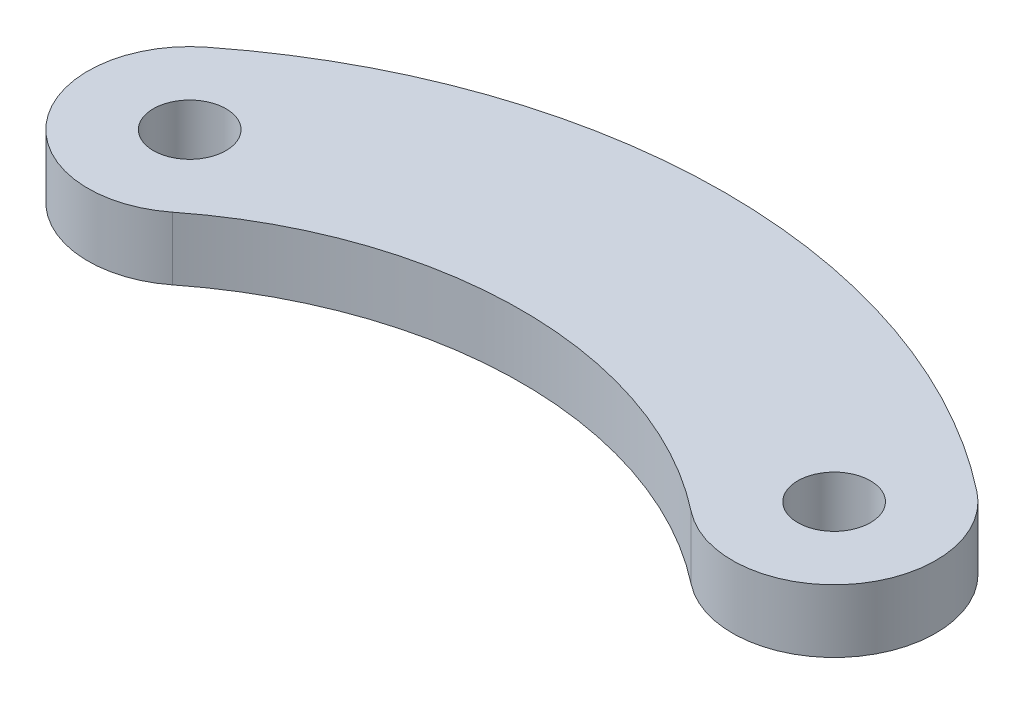
ISO-10303-21;
HEADER;
FILE_DESCRIPTION(('STEP AP214'),'2;1');
FILE_NAME('part.step','',(''),(''),'','','');
FILE_SCHEMA(('AUTOMOTIVE_DESIGN { 1 0 10303 214 1 1 1 1 }'));
ENDSEC;
DATA;
#1=APPLICATION_CONTEXT('core data for automotive mechanical design processes');
#2=APPLICATION_PROTOCOL_DEFINITION('international standard','automotive_design',2000,#1);
#3=PRODUCT_CONTEXT('',#1,'mechanical');
#4=PRODUCT('Part','Part','',(#3));
#5=PRODUCT_RELATED_PRODUCT_CATEGORY('part','',(#4));
#6=PRODUCT_DEFINITION_FORMATION('','',#4);
#7=PRODUCT_DEFINITION_CONTEXT('part definition',#1,'design');
#8=PRODUCT_DEFINITION('design','',#6,#7);
#9=PRODUCT_DEFINITION_SHAPE('','',#8);
#10=(LENGTH_UNIT() NAMED_UNIT(*) SI_UNIT(.MILLI.,.METRE.));
#11=(NAMED_UNIT(*) PLANE_ANGLE_UNIT() SI_UNIT($,.RADIAN.));
#12=(NAMED_UNIT(*) SI_UNIT($,.STERADIAN.) SOLID_ANGLE_UNIT());
#13=UNCERTAINTY_MEASURE_WITH_UNIT(LENGTH_MEASURE(1.E-05),#10,'distance_accuracy_value','');
#14=(GEOMETRIC_REPRESENTATION_CONTEXT(3) GLOBAL_UNCERTAINTY_ASSIGNED_CONTEXT((#13)) GLOBAL_UNIT_ASSIGNED_CONTEXT((#10,
#11,#12)) REPRESENTATION_CONTEXT('',''));
#15=CARTESIAN_POINT('',(0.,0.,0.));
#16=DIRECTION('',(0.,0.,1.));
#17=DIRECTION('',(1.,0.,0.));
#18=AXIS2_PLACEMENT_3D('',#15,#16,#17);
#19=CARTESIAN_POINT('',(-6.65,2.6,-8.46358695652175));
#20=DIRECTION('',(0.,1.,0.));
#21=DIRECTION('',(0.,0.,1.));
#22=AXIS2_PLACEMENT_3D('',#19,#20,#21);
#23=PLANE('',#22);
#24=CARTESIAN_POINT('',(13.3,2.6,-16.9271739130435));
#25=DIRECTION('',(0.,1.,0.));
#26=DIRECTION('',(0.,0.,1.));
#27=AXIS2_PLACEMENT_3D('',#24,#25,#26);
#28=CIRCLE('',#27,1.5);
#29=CARTESIAN_POINT('',(13.3,2.6,-15.4271739130435));
#30=VERTEX_POINT('',#29);
#31=EDGE_CURVE('E99',#30,#30,#28,.T.);
#32=ORIENTED_EDGE('',*,*,#31,.F.);
#33=EDGE_LOOP('',(#32));
#34=FACE_BOUND('',#33,.T.);
#35=CARTESIAN_POINT('',(-13.3,2.6,-16.9271739130435));
#36=DIRECTION('',(0.,1.,0.));
#37=DIRECTION('',(0.,0.,1.));
#38=AXIS2_PLACEMENT_3D('',#35,#36,#37);
#39=CIRCLE('',#38,4.2);
#40=CARTESIAN_POINT('',(-15.8948598838677,2.6,-20.2297035772697));
#41=VERTEX_POINT('',#40);
#42=CARTESIAN_POINT('',(-10.7051401161323,2.6,-13.6246442488173));
#43=VERTEX_POINT('',#42);
#44=EDGE_CURVE('E84',#41,#43,#39,.T.);
#45=ORIENTED_EDGE('',*,*,#44,.T.);
#46=CARTESIAN_POINT('',(0.,2.6,0.));
#47=DIRECTION('',(0.,-1.,0.));
#48=DIRECTION('',(0.,0.,1.));
#49=AXIS2_PLACEMENT_3D('',#46,#47,#48);
#50=CIRCLE('',#49,17.3271739130435);
#51=CARTESIAN_POINT('',(10.7051401161323,2.6,-13.6246442488173));
#52=VERTEX_POINT('',#51);
#53=EDGE_CURVE('E79',#43,#52,#50,.T.);
#54=ORIENTED_EDGE('',*,*,#53,.T.);
#55=CARTESIAN_POINT('',(13.3,2.6,-16.9271739130435));
#56=DIRECTION('',(0.,1.,0.));
#57=DIRECTION('',(0.,0.,1.));
#58=AXIS2_PLACEMENT_3D('',#55,#56,#57);
#59=CIRCLE('',#58,4.2);
#60=CARTESIAN_POINT('',(15.8948598838677,2.6,-20.2297035772697));
#61=VERTEX_POINT('',#60);
#62=EDGE_CURVE('E82',#52,#61,#59,.T.);
#63=ORIENTED_EDGE('',*,*,#62,.T.);
#64=CARTESIAN_POINT('',(0.,2.6,0.));
#65=DIRECTION('',(0.,1.,0.));
#66=DIRECTION('',(0.,0.,1.));
#67=AXIS2_PLACEMENT_3D('',#64,#65,#66);
#68=CIRCLE('',#67,25.7271739130435);
#69=EDGE_CURVE('E49',#61,#41,#68,.T.);
#70=ORIENTED_EDGE('',*,*,#69,.T.);
#71=EDGE_LOOP('',(#45,#54,#63,#70));
#72=FACE_BOUND('',#71,.T.);
#73=CARTESIAN_POINT('',(-13.3,2.6,-16.9271739130435));
#74=DIRECTION('',(0.,1.,0.));
#75=DIRECTION('',(0.,0.,1.));
#76=AXIS2_PLACEMENT_3D('',#73,#74,#75);
#77=CIRCLE('',#76,1.5);
#78=CARTESIAN_POINT('',(-13.3,2.6,-15.4271739130435));
#79=VERTEX_POINT('',#78);
#80=EDGE_CURVE('E114',#79,#79,#77,.T.);
#81=ORIENTED_EDGE('',*,*,#80,.F.);
#82=EDGE_LOOP('',(#81));
#83=FACE_BOUND('',#82,.T.);
#84=ADVANCED_FACE('F32',(#34,#72,#83),#23,.T.);
#85=CARTESIAN_POINT('',(-6.65,0.,-8.46358695652175));
#86=DIRECTION('',(0.,1.,0.));
#87=DIRECTION('',(0.,0.,1.));
#88=AXIS2_PLACEMENT_3D('',#85,#86,#87);
#89=PLANE('',#88);
#90=CARTESIAN_POINT('',(13.3,0.,-16.9271739130435));
#91=DIRECTION('',(0.,1.,0.));
#92=DIRECTION('',(0.,0.,1.));
#93=AXIS2_PLACEMENT_3D('',#90,#91,#92);
#94=CIRCLE('',#93,1.5);
#95=CARTESIAN_POINT('',(13.3,0.,-15.4271739130435));
#96=VERTEX_POINT('',#95);
#97=EDGE_CURVE('E111',#96,#96,#94,.T.);
#98=ORIENTED_EDGE('',*,*,#97,.T.);
#99=EDGE_LOOP('',(#98));
#100=FACE_BOUND('',#99,.T.);
#101=CARTESIAN_POINT('',(-13.3,0.,-16.9271739130435));
#102=DIRECTION('',(0.,1.,0.));
#103=DIRECTION('',(0.,0.,1.));
#104=AXIS2_PLACEMENT_3D('',#101,#102,#103);
#105=CIRCLE('',#104,4.2);
#106=CARTESIAN_POINT('',(-15.8948598838677,0.,-20.2297035772697));
#107=VERTEX_POINT('',#106);
#108=CARTESIAN_POINT('',(-10.7051401161323,0.,-13.6246442488173));
#109=VERTEX_POINT('',#108);
#110=EDGE_CURVE('E96',#107,#109,#105,.T.);
#111=ORIENTED_EDGE('',*,*,#110,.F.);
#112=CARTESIAN_POINT('',(0.,0.,0.));
#113=DIRECTION('',(0.,1.,0.));
#114=DIRECTION('',(0.,0.,1.));
#115=AXIS2_PLACEMENT_3D('',#112,#113,#114);
#116=CIRCLE('',#115,25.7271739130435);
#117=CARTESIAN_POINT('',(15.8948598838677,0.,-20.2297035772697));
#118=VERTEX_POINT('',#117);
#119=EDGE_CURVE('E72',#118,#107,#116,.T.);
#120=ORIENTED_EDGE('',*,*,#119,.F.);
#121=CARTESIAN_POINT('',(13.3,0.,-16.9271739130435));
#122=DIRECTION('',(0.,1.,0.));
#123=DIRECTION('',(0.,0.,1.));
#124=AXIS2_PLACEMENT_3D('',#121,#122,#123);
#125=CIRCLE('',#124,4.2);
#126=CARTESIAN_POINT('',(10.7051401161323,0.,-13.6246442488173));
#127=VERTEX_POINT('',#126);
#128=EDGE_CURVE('E66',#127,#118,#125,.T.);
#129=ORIENTED_EDGE('',*,*,#128,.F.);
#130=CARTESIAN_POINT('',(0.,0.,0.));
#131=DIRECTION('',(0.,-1.,0.));
#132=DIRECTION('',(0.,0.,1.));
#133=AXIS2_PLACEMENT_3D('',#130,#131,#132);
#134=CIRCLE('',#133,17.3271739130435);
#135=EDGE_CURVE('E88',#109,#127,#134,.T.);
#136=ORIENTED_EDGE('',*,*,#135,.F.);
#137=EDGE_LOOP('',(#111,#120,#129,#136));
#138=FACE_BOUND('',#137,.T.);
#139=CARTESIAN_POINT('',(-13.3,0.,-16.9271739130435));
#140=DIRECTION('',(0.,1.,0.));
#141=DIRECTION('',(0.,0.,1.));
#142=AXIS2_PLACEMENT_3D('',#139,#140,#141);
#143=CIRCLE('',#142,1.5);
#144=CARTESIAN_POINT('',(-13.3,0.,-15.4271739130435));
#145=VERTEX_POINT('',#144);
#146=EDGE_CURVE('E117',#145,#145,#143,.T.);
#147=ORIENTED_EDGE('',*,*,#146,.T.);
#148=EDGE_LOOP('',(#147));
#149=FACE_BOUND('',#148,.T.);
#150=ADVANCED_FACE('F107',(#100,#138,#149),#89,.F.);
#151=CARTESIAN_POINT('',(-13.3,2.6,-16.9271739130435));
#152=DIRECTION('',(0.,-1.,0.));
#153=DIRECTION('',(0.,0.,-1.));
#154=AXIS2_PLACEMENT_3D('',#151,#152,#153);
#155=CYLINDRICAL_SURFACE('',#154,4.2);
#156=ORIENTED_EDGE('',*,*,#110,.T.);
#157=DIRECTION('',(0.,-1.,0.));
#158=VECTOR('',#157,1.);
#159=CARTESIAN_POINT('',(-10.7051401161323,2.6,-13.6246442488173));
#160=LINE('',#159,#158);
#161=EDGE_CURVE('E11',#43,#109,#160,.T.);
#162=ORIENTED_EDGE('',*,*,#161,.F.);
#163=ORIENTED_EDGE('',*,*,#44,.F.);
#164=DIRECTION('',(0.,-1.,0.));
#165=VECTOR('',#164,1.);
#166=CARTESIAN_POINT('',(-15.8948598838677,2.6,-20.2297035772697));
#167=LINE('',#166,#165);
#168=EDGE_CURVE('E92',#41,#107,#167,.T.);
#169=ORIENTED_EDGE('',*,*,#168,.T.);
#170=EDGE_LOOP('',(#156,#162,#163,#169));
#171=FACE_BOUND('',#170,.T.);
#172=ADVANCED_FACE('F34',(#171),#155,.T.);
#173=CARTESIAN_POINT('',(0.,2.6,0.));
#174=DIRECTION('',(0.,-1.,0.));
#175=DIRECTION('',(0.,0.,-1.));
#176=AXIS2_PLACEMENT_3D('',#173,#174,#175);
#177=CYLINDRICAL_SURFACE('',#176,17.3271739130435);
#178=ORIENTED_EDGE('',*,*,#135,.T.);
#179=DIRECTION('',(0.,-1.,0.));
#180=VECTOR('',#179,1.);
#181=CARTESIAN_POINT('',(10.7051401161323,2.6,-13.6246442488173));
#182=LINE('',#181,#180);
#183=EDGE_CURVE('E41',#52,#127,#182,.T.);
#184=ORIENTED_EDGE('',*,*,#183,.F.);
#185=ORIENTED_EDGE('',*,*,#53,.F.);
#186=ORIENTED_EDGE('',*,*,#161,.T.);
#187=EDGE_LOOP('',(#178,#184,#185,#186));
#188=FACE_BOUND('',#187,.T.);
#189=ADVANCED_FACE('F87',(#188),#177,.F.);
#190=CARTESIAN_POINT('',(13.3,2.6,-16.9271739130435));
#191=DIRECTION('',(0.,-1.,0.));
#192=DIRECTION('',(0.,0.,-1.));
#193=AXIS2_PLACEMENT_3D('',#190,#191,#192);
#194=CYLINDRICAL_SURFACE('',#193,4.2);
#195=ORIENTED_EDGE('',*,*,#128,.T.);
#196=DIRECTION('',(0.,-1.,0.));
#197=VECTOR('',#196,1.);
#198=CARTESIAN_POINT('',(15.8948598838677,2.6,-20.2297035772697));
#199=LINE('',#198,#197);
#200=EDGE_CURVE('E89',#61,#118,#199,.T.);
#201=ORIENTED_EDGE('',*,*,#200,.F.);
#202=ORIENTED_EDGE('',*,*,#62,.F.);
#203=ORIENTED_EDGE('',*,*,#183,.T.);
#204=EDGE_LOOP('',(#195,#201,#202,#203));
#205=FACE_BOUND('',#204,.T.);
#206=ADVANCED_FACE('F90',(#205),#194,.T.);
#207=CARTESIAN_POINT('',(0.,2.6,0.));
#208=DIRECTION('',(0.,-1.,0.));
#209=DIRECTION('',(0.,0.,-1.));
#210=AXIS2_PLACEMENT_3D('',#207,#208,#209);
#211=CYLINDRICAL_SURFACE('',#210,25.7271739130435);
#212=ORIENTED_EDGE('',*,*,#119,.T.);
#213=ORIENTED_EDGE('',*,*,#168,.F.);
#214=ORIENTED_EDGE('',*,*,#69,.F.);
#215=ORIENTED_EDGE('',*,*,#200,.T.);
#216=EDGE_LOOP('',(#212,#213,#214,#215));
#217=FACE_BOUND('',#216,.T.);
#218=ADVANCED_FACE('F104',(#217),#211,.T.);
#219=CARTESIAN_POINT('',(13.3,2.6,-16.9271739130435));
#220=DIRECTION('',(0.,-1.,0.));
#221=DIRECTION('',(0.,0.,-1.));
#222=AXIS2_PLACEMENT_3D('',#219,#220,#221);
#223=CYLINDRICAL_SURFACE('',#222,1.5);
#224=ORIENTED_EDGE('',*,*,#31,.T.);
#225=EDGE_LOOP('',(#224));
#226=FACE_BOUND('',#225,.T.);
#227=ORIENTED_EDGE('',*,*,#97,.F.);
#228=EDGE_LOOP('',(#227));
#229=FACE_BOUND('',#228,.T.);
#230=ADVANCED_FACE('F135',(#226,#229),#223,.F.);
#231=CARTESIAN_POINT('',(-13.3,2.6,-16.9271739130435));
#232=DIRECTION('',(0.,-1.,0.));
#233=DIRECTION('',(0.,0.,-1.));
#234=AXIS2_PLACEMENT_3D('',#231,#232,#233);
#235=CYLINDRICAL_SURFACE('',#234,1.5);
#236=ORIENTED_EDGE('',*,*,#80,.T.);
#237=EDGE_LOOP('',(#236));
#238=FACE_BOUND('',#237,.T.);
#239=ORIENTED_EDGE('',*,*,#146,.F.);
#240=EDGE_LOOP('',(#239));
#241=FACE_BOUND('',#240,.T.);
#242=ADVANCED_FACE('F123',(#238,#241),#235,.F.);
#243=CLOSED_SHELL('',(#84,#150,#172,#189,#206,#218,#230,#242));
#244=MANIFOLD_SOLID_BREP('B2',#243);
#245=ADVANCED_BREP_SHAPE_REPRESENTATION('',(#18,#244),#14);
#246=SHAPE_DEFINITION_REPRESENTATION(#9,#245);
ENDSEC;
END-ISO-10303-21;
